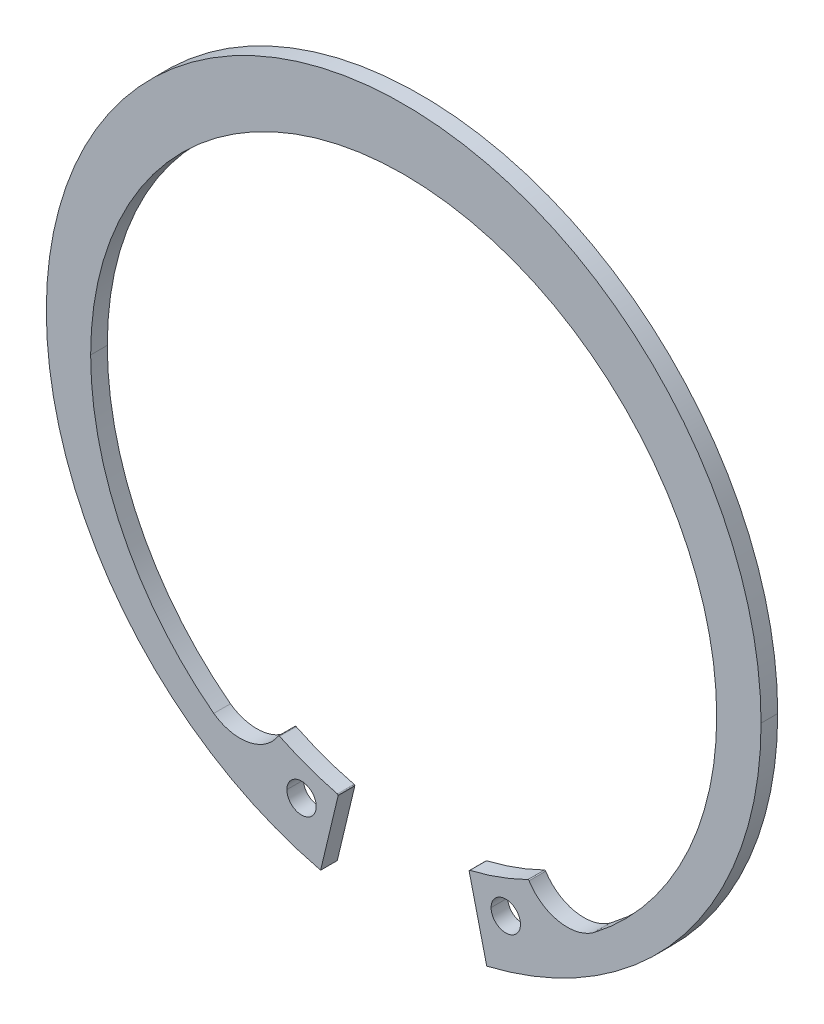
ISO-10303-21;
HEADER;
FILE_DESCRIPTION(('STEP AP214'),'2;1');
FILE_NAME('part.step','',(''),(''),'','','');
FILE_SCHEMA(('AUTOMOTIVE_DESIGN { 1 0 10303 214 1 1 1 1 }'));
ENDSEC;
DATA;
#1=APPLICATION_CONTEXT('core data for automotive mechanical design processes');
#2=APPLICATION_PROTOCOL_DEFINITION('international standard','automotive_design',2000,#1);
#3=PRODUCT_CONTEXT('',#1,'mechanical');
#4=PRODUCT('Part','Part','',(#3));
#5=PRODUCT_RELATED_PRODUCT_CATEGORY('part','',(#4));
#6=PRODUCT_DEFINITION_FORMATION('','',#4);
#7=PRODUCT_DEFINITION_CONTEXT('part definition',#1,'design');
#8=PRODUCT_DEFINITION('design','',#6,#7);
#9=PRODUCT_DEFINITION_SHAPE('','',#8);
#10=(LENGTH_UNIT() NAMED_UNIT(*) SI_UNIT(.MILLI.,.METRE.));
#11=(NAMED_UNIT(*) PLANE_ANGLE_UNIT() SI_UNIT($,.RADIAN.));
#12=(NAMED_UNIT(*) SI_UNIT($,.STERADIAN.) SOLID_ANGLE_UNIT());
#13=UNCERTAINTY_MEASURE_WITH_UNIT(LENGTH_MEASURE(1.E-05),#10,'distance_accuracy_value','');
#14=(GEOMETRIC_REPRESENTATION_CONTEXT(3) GLOBAL_UNCERTAINTY_ASSIGNED_CONTEXT((#13)) GLOBAL_UNIT_ASSIGNED_CONTEXT((#10,
#11,#12)) REPRESENTATION_CONTEXT('',''));
#15=CARTESIAN_POINT('',(0.,0.,0.));
#16=DIRECTION('',(0.,0.,1.));
#17=DIRECTION('',(1.,0.,0.));
#18=AXIS2_PLACEMENT_3D('',#15,#16,#17);
#19=CARTESIAN_POINT('',(-6.79031486078418,-27.9880621710655,-1.70000000000003));
#20=DIRECTION('',(0.,0.,1.));
#21=DIRECTION('',(1.,0.,0.));
#22=AXIS2_PLACEMENT_3D('',#19,#20,#21);
#23=CYLINDRICAL_SURFACE('',#22,0.100000000000003);
#24=DIRECTION('',(0.,0.,1.));
#25=VECTOR('',#24,1.);
#26=CARTESIAN_POINT('',(-6.69031486078418,-27.9880621710653,-1.69999999999959));
#27=LINE('',#26,#25);
#28=CARTESIAN_POINT('',(-6.69031486078418,-27.9880621710653,-1.69999999999959));
#29=VERTEX_POINT('',#28);
#30=CARTESIAN_POINT('',(-6.69031486078418,-27.9880621710662,0.));
#31=VERTEX_POINT('',#30);
#32=EDGE_CURVE('E239',#29,#31,#27,.T.);
#33=ORIENTED_EDGE('',*,*,#32,.F.);
#34=CARTESIAN_POINT('',(-6.79031486078418,-27.9880621710655,-1.70000000000003));
#35=DIRECTION('',(0.,0.,1.));
#36=DIRECTION('',(-1.,0.,0.));
#37=AXIS2_PLACEMENT_3D('',#34,#35,#36);
#38=CIRCLE('',#37,0.100000000000003);
#39=CARTESIAN_POINT('',(-6.76673737862868,-27.8908813996381,-1.70000000000003));
#40=VERTEX_POINT('',#39);
#41=EDGE_CURVE('E271',#29,#40,#38,.T.);
#42=ORIENTED_EDGE('',*,*,#41,.T.);
#43=DIRECTION('',(0.,0.,1.));
#44=VECTOR('',#43,1.);
#45=CARTESIAN_POINT('',(-6.76673737862868,-27.8908813996381,-1.70000000000003));
#46=LINE('',#45,#44);
#47=CARTESIAN_POINT('',(-6.76673737862868,-27.8908813996375,0.));
#48=VERTEX_POINT('',#47);
#49=EDGE_CURVE('E336',#40,#48,#46,.T.);
#50=ORIENTED_EDGE('',*,*,#49,.T.);
#51=CARTESIAN_POINT('',(-6.79031486078418,-27.988062171066,0.));
#52=DIRECTION('',(0.,0.,1.));
#53=DIRECTION('',(-1.,0.,0.));
#54=AXIS2_PLACEMENT_3D('',#51,#52,#53);
#55=CIRCLE('',#54,0.100000000000003);
#56=EDGE_CURVE('E189',#31,#48,#55,.T.);
#57=ORIENTED_EDGE('',*,*,#56,.F.);
#58=EDGE_LOOP('',(#33,#42,#50,#57));
#59=FACE_BOUND('',#58,.T.);
#60=ADVANCED_FACE('F16',(#59),#23,.T.);
#61=CARTESIAN_POINT('',(-12.7185706541598,-25.8394651747116,-1.70000000000003));
#62=DIRECTION('',(0.,0.,1.));
#63=DIRECTION('',(1.,0.,0.));
#64=AXIS2_PLACEMENT_3D('',#61,#62,#63);
#65=CYLINDRICAL_SURFACE('',#64,0.1);
#66=CARTESIAN_POINT('',(-12.7185706541598,-25.8394651747118,0.));
#67=DIRECTION('',(0.,0.,1.));
#68=DIRECTION('',(1.,0.,0.));
#69=AXIS2_PLACEMENT_3D('',#66,#67,#68);
#70=CIRCLE('',#69,0.1);
#71=CARTESIAN_POINT('',(-12.6744089504996,-25.7497448095225,0.));
#72=VERTEX_POINT('',#71);
#73=CARTESIAN_POINT('',(-12.8032663505432,-25.7862990293358,0.));
#74=VERTEX_POINT('',#73);
#75=EDGE_CURVE('E299',#72,#74,#70,.T.);
#76=ORIENTED_EDGE('',*,*,#75,.F.);
#77=DIRECTION('',(0.,0.,1.));
#78=VECTOR('',#77,1.);
#79=CARTESIAN_POINT('',(-12.6744089504996,-25.7497448095225,-1.70000000000048));
#80=LINE('',#79,#78);
#81=CARTESIAN_POINT('',(-12.6744089504996,-25.7497448095225,-1.70000000000048));
#82=VERTEX_POINT('',#81);
#83=EDGE_CURVE('E340',#82,#72,#80,.T.);
#84=ORIENTED_EDGE('',*,*,#83,.F.);
#85=CARTESIAN_POINT('',(-12.7185706541598,-25.8394651747116,-1.70000000000003));
#86=DIRECTION('',(0.,0.,1.));
#87=DIRECTION('',(1.,0.,0.));
#88=AXIS2_PLACEMENT_3D('',#85,#86,#87);
#89=CIRCLE('',#88,0.1);
#90=CARTESIAN_POINT('',(-12.8032663505432,-25.7862990293358,-1.69999999999959));
#91=VERTEX_POINT('',#90);
#92=EDGE_CURVE('E234',#82,#91,#89,.T.);
#93=ORIENTED_EDGE('',*,*,#92,.T.);
#94=DIRECTION('',(0.,0.,1.));
#95=VECTOR('',#94,1.);
#96=CARTESIAN_POINT('',(-12.8032663505432,-25.7862990293358,-1.69999999999959));
#97=LINE('',#96,#95);
#98=EDGE_CURVE('E11',#91,#74,#97,.T.);
#99=ORIENTED_EDGE('',*,*,#98,.T.);
#100=EDGE_LOOP('',(#76,#84,#93,#99));
#101=FACE_BOUND('',#100,.T.);
#102=ADVANCED_FACE('F529',(#101),#65,.T.);
#103=CARTESIAN_POINT('',(-16.7085661781746,-23.3348198250933,-1.70000000000003));
#104=DIRECTION('',(0.,0.,1.));
#105=DIRECTION('',(1.,0.,0.));
#106=AXIS2_PLACEMENT_3D('',#103,#104,#105);
#107=CYLINDRICAL_SURFACE('',#106,4.61097788245976);
#108=CARTESIAN_POINT('',(-16.7085661781746,-23.3348198250931,0.));
#109=DIRECTION('',(0.,0.,-1.));
#110=DIRECTION('',(1.,0.,0.));
#111=AXIS2_PLACEMENT_3D('',#108,#109,#110);
#112=CIRCLE('',#111,4.61097788245976);
#113=CARTESIAN_POINT('',(-19.3929853104109,-27.0838211527826,0.));
#114=VERTEX_POINT('',#113);
#115=EDGE_CURVE('E302',#74,#114,#112,.T.);
#116=ORIENTED_EDGE('',*,*,#115,.F.);
#117=ORIENTED_EDGE('',*,*,#98,.F.);
#118=CARTESIAN_POINT('',(-16.7085661781746,-23.3348198250933,-1.70000000000003));
#119=DIRECTION('',(0.,0.,-1.));
#120=DIRECTION('',(1.,0.,0.));
#121=AXIS2_PLACEMENT_3D('',#118,#119,#120);
#122=CIRCLE('',#121,4.61097788245976);
#123=CARTESIAN_POINT('',(-19.3929853104108,-27.0838211527826,-1.70000000000048));
#124=VERTEX_POINT('',#123);
#125=EDGE_CURVE('E228',#91,#124,#122,.T.);
#126=ORIENTED_EDGE('',*,*,#125,.T.);
#127=DIRECTION('',(0.,0.,1.));
#128=VECTOR('',#127,1.);
#129=CARTESIAN_POINT('',(-19.3929853104108,-27.0838211527826,-1.70000000000048));
#130=LINE('',#129,#128);
#131=EDGE_CURVE('E30',#124,#114,#130,.T.);
#132=ORIENTED_EDGE('',*,*,#131,.T.);
#133=EDGE_LOOP('',(#116,#117,#126,#132));
#134=FACE_BOUND('',#133,.T.);
#135=ADVANCED_FACE('F528',(#134),#107,.F.);
#136=CARTESIAN_POINT('',(-21.2495702265985,-29.6766872340033,-1.70000000000003));
#137=DIRECTION('',(-0.813059924219273,0.582180006208175,0.));
#138=DIRECTION('',(0.,0.,1.));
#139=AXIS2_PLACEMENT_3D('',#136,#137,#138);
#140=PLANE('',#139);
#141=DIRECTION('',(-0.582180006208175,-0.813059924219272,0.));
#142=VECTOR('',#141,1.);
#143=CARTESIAN_POINT('',(-21.2495702265985,-29.6766872340033,-1.70000000000003));
#144=LINE('',#143,#142);
#145=CARTESIAN_POINT('',(-19.3944374301315,-27.0858491515757,-1.70000000000003));
#146=VERTEX_POINT('',#145);
#147=EDGE_CURVE('E231',#124,#146,#144,.T.);
#148=ORIENTED_EDGE('',*,*,#147,.T.);
#149=DIRECTION('',(0.,0.,1.));
#150=VECTOR('',#149,1.);
#151=CARTESIAN_POINT('',(-19.3944374301315,-27.0858491515757,-1.70000000000003));
#152=LINE('',#151,#150);
#153=CARTESIAN_POINT('',(-19.3944374301315,-27.0858491515762,-4.44089209850063E-13));
#154=VERTEX_POINT('',#153);
#155=EDGE_CURVE('E253',#146,#154,#152,.T.);
#156=ORIENTED_EDGE('',*,*,#155,.T.);
#157=DIRECTION('',(-0.582180006208175,-0.813059924219272,0.));
#158=VECTOR('',#157,1.);
#159=CARTESIAN_POINT('',(-21.2495702265985,-29.6766872340033,0.));
#160=LINE('',#159,#158);
#161=EDGE_CURVE('E233',#114,#154,#160,.T.);
#162=ORIENTED_EDGE('',*,*,#161,.F.);
#163=ORIENTED_EDGE('',*,*,#131,.F.);
#164=EDGE_LOOP('',(#148,#156,#162,#163));
#165=FACE_BOUND('',#164,.T.);
#166=ADVANCED_FACE('F534',(#165),#140,.T.);
#167=CARTESIAN_POINT('',(0.,0.,-1.70000000000003));
#168=DIRECTION('',(0.,0.,1.));
#169=DIRECTION('',(1.,0.,0.));
#170=AXIS2_PLACEMENT_3D('',#167,#168,#169);
#171=CYLINDRICAL_SURFACE('',#170,28.7);
#172=CARTESIAN_POINT('',(0.,0.,0.));
#173=DIRECTION('',(0.,0.,-1.));
#174=DIRECTION('',(1.,0.,0.));
#175=AXIS2_PLACEMENT_3D('',#172,#173,#174);
#176=CIRCLE('',#175,28.7);
#177=EDGE_CURVE('E304',#48,#72,#176,.T.);
#178=ORIENTED_EDGE('',*,*,#177,.F.);
#179=ORIENTED_EDGE('',*,*,#49,.F.);
#180=CARTESIAN_POINT('',(0.,0.,-1.70000000000003));
#181=DIRECTION('',(0.,0.,-1.));
#182=DIRECTION('',(1.,0.,0.));
#183=AXIS2_PLACEMENT_3D('',#180,#181,#182);
#184=CIRCLE('',#183,28.7);
#185=EDGE_CURVE('E274',#40,#82,#184,.T.);
#186=ORIENTED_EDGE('',*,*,#185,.T.);
#187=ORIENTED_EDGE('',*,*,#83,.T.);
#188=EDGE_LOOP('',(#178,#179,#186,#187));
#189=FACE_BOUND('',#188,.T.);
#190=ADVANCED_FACE('F541',(#189),#171,.F.);
#191=CARTESIAN_POINT('',(19.3929853104109,-27.0838211527822,-1.70000000000003));
#192=DIRECTION('',(0.813059924219273,0.582180006208175,0.));
#193=DIRECTION('',(0.,0.,-1.));
#194=AXIS2_PLACEMENT_3D('',#191,#192,#193);
#195=PLANE('',#194);
#196=DIRECTION('',(-0.582180006208175,0.813059924219272,0.));
#197=VECTOR('',#196,1.);
#198=CARTESIAN_POINT('',(19.3929853104109,-27.0838211527826,0.));
#199=LINE('',#198,#197);
#200=CARTESIAN_POINT('',(19.3944374301315,-27.0858491515751,0.));
#201=VERTEX_POINT('',#200);
#202=CARTESIAN_POINT('',(19.3929853104109,-27.0838211527826,0.));
#203=VERTEX_POINT('',#202);
#204=EDGE_CURVE('E238',#201,#203,#199,.T.);
#205=ORIENTED_EDGE('',*,*,#204,.F.);
#206=DIRECTION('',(0.,0.,-1.));
#207=VECTOR('',#206,1.);
#208=CARTESIAN_POINT('',(19.3944374301315,-27.085849151576,-1.69999999999959));
#209=LINE('',#208,#207);
#210=CARTESIAN_POINT('',(19.3944374301315,-27.085849151576,-1.69999999999959));
#211=VERTEX_POINT('',#210);
#212=EDGE_CURVE('E259',#201,#211,#209,.T.);
#213=ORIENTED_EDGE('',*,*,#212,.T.);
#214=DIRECTION('',(-0.582180006208175,0.813059924219272,0.));
#215=VECTOR('',#214,1.);
#216=CARTESIAN_POINT('',(19.3929853104109,-27.0838211527822,-1.70000000000003));
#217=LINE('',#216,#215);
#218=CARTESIAN_POINT('',(19.3929853104109,-27.0838211527822,-1.70000000000003));
#219=VERTEX_POINT('',#218);
#220=EDGE_CURVE('E20',#211,#219,#217,.T.);
#221=ORIENTED_EDGE('',*,*,#220,.T.);
#222=DIRECTION('',(0.,0.,1.));
#223=VECTOR('',#222,1.);
#224=CARTESIAN_POINT('',(19.3929853104109,-27.0838211527822,-1.70000000000003));
#225=LINE('',#224,#223);
#226=EDGE_CURVE('E285',#219,#203,#225,.T.);
#227=ORIENTED_EDGE('',*,*,#226,.T.);
#228=EDGE_LOOP('',(#205,#213,#221,#227));
#229=FACE_BOUND('',#228,.T.);
#230=ADVANCED_FACE('F588',(#229),#195,.T.);
#231=CARTESIAN_POINT('',(16.7085661781746,-23.3348198250938,-1.69999999999959));
#232=DIRECTION('',(0.,0.,1.));
#233=DIRECTION('',(1.,0.,0.));
#234=AXIS2_PLACEMENT_3D('',#231,#232,#233);
#235=CYLINDRICAL_SURFACE('',#234,4.61097788245976);
#236=CARTESIAN_POINT('',(16.7085661781746,-23.3348198250931,0.));
#237=DIRECTION('',(0.,0.,-1.));
#238=DIRECTION('',(1.,0.,0.));
#239=AXIS2_PLACEMENT_3D('',#236,#237,#238);
#240=CIRCLE('',#239,4.61097788245976);
#241=CARTESIAN_POINT('',(12.8032663505432,-25.7862990293358,0.));
#242=VERTEX_POINT('',#241);
#243=EDGE_CURVE('E254',#203,#242,#240,.T.);
#244=ORIENTED_EDGE('',*,*,#243,.F.);
#245=ORIENTED_EDGE('',*,*,#226,.F.);
#246=CARTESIAN_POINT('',(16.7085661781746,-23.3348198250938,-1.69999999999959));
#247=DIRECTION('',(0.,0.,-1.));
#248=DIRECTION('',(1.,0.,0.));
#249=AXIS2_PLACEMENT_3D('',#246,#247,#248);
#250=CIRCLE('',#249,4.61097788245976);
#251=CARTESIAN_POINT('',(12.8032663505432,-25.7862990293358,-1.69999999999959));
#252=VERTEX_POINT('',#251);
#253=EDGE_CURVE('E316',#219,#252,#250,.T.);
#254=ORIENTED_EDGE('',*,*,#253,.T.);
#255=DIRECTION('',(0.,0.,1.));
#256=VECTOR('',#255,1.);
#257=CARTESIAN_POINT('',(12.8032663505432,-25.7862990293358,-1.69999999999959));
#258=LINE('',#257,#256);
#259=EDGE_CURVE('E282',#252,#242,#258,.T.);
#260=ORIENTED_EDGE('',*,*,#259,.T.);
#261=EDGE_LOOP('',(#244,#245,#254,#260));
#262=FACE_BOUND('',#261,.T.);
#263=ADVANCED_FACE('F581',(#262),#235,.F.);
#264=CARTESIAN_POINT('',(12.7185706541598,-25.8394651747118,-1.70000000000003));
#265=DIRECTION('',(0.,0.,1.));
#266=DIRECTION('',(1.,0.,0.));
#267=AXIS2_PLACEMENT_3D('',#264,#265,#266);
#268=CYLINDRICAL_SURFACE('',#267,0.1);
#269=CARTESIAN_POINT('',(12.7185706541598,-25.8394651747118,0.));
#270=DIRECTION('',(0.,0.,1.));
#271=DIRECTION('',(-1.,0.,0.));
#272=AXIS2_PLACEMENT_3D('',#269,#270,#271);
#273=CIRCLE('',#272,0.1);
#274=CARTESIAN_POINT('',(12.6744089504995,-25.7497448095219,0.));
#275=VERTEX_POINT('',#274);
#276=EDGE_CURVE('E300',#242,#275,#273,.T.);
#277=ORIENTED_EDGE('',*,*,#276,.F.);
#278=ORIENTED_EDGE('',*,*,#259,.F.);
#279=CARTESIAN_POINT('',(12.7185706541598,-25.8394651747118,-1.70000000000003));
#280=DIRECTION('',(0.,0.,1.));
#281=DIRECTION('',(-1.,0.,0.));
#282=AXIS2_PLACEMENT_3D('',#279,#280,#281);
#283=CIRCLE('',#282,0.1);
#284=CARTESIAN_POINT('',(12.6744089504995,-25.7497448095219,-1.70000000000003));
#285=VERTEX_POINT('',#284);
#286=EDGE_CURVE('E315',#252,#285,#283,.T.);
#287=ORIENTED_EDGE('',*,*,#286,.T.);
#288=DIRECTION('',(0.,0.,1.));
#289=VECTOR('',#288,1.);
#290=CARTESIAN_POINT('',(12.6744089504995,-25.7497448095219,-1.70000000000003));
#291=LINE('',#290,#289);
#292=EDGE_CURVE('E331',#285,#275,#291,.T.);
#293=ORIENTED_EDGE('',*,*,#292,.T.);
#294=EDGE_LOOP('',(#277,#278,#287,#293));
#295=FACE_BOUND('',#294,.T.);
#296=ADVANCED_FACE('F579',(#295),#268,.T.);
#297=CARTESIAN_POINT('',(6.79031486078418,-27.9880621710646,-1.70000000000048));
#298=DIRECTION('',(0.,0.,1.));
#299=DIRECTION('',(1.,0.,0.));
#300=AXIS2_PLACEMENT_3D('',#297,#298,#299);
#301=CYLINDRICAL_SURFACE('',#300,0.100000000000002);
#302=CARTESIAN_POINT('',(6.79031486078418,-27.9880621710653,0.));
#303=DIRECTION('',(0.,0.,1.));
#304=DIRECTION('',(1.,0.,0.));
#305=AXIS2_PLACEMENT_3D('',#302,#303,#304);
#306=CIRCLE('',#305,0.100000000000002);
#307=CARTESIAN_POINT('',(6.76673737862868,-27.8908813996377,0.));
#308=VERTEX_POINT('',#307);
#309=CARTESIAN_POINT('',(6.69305280892274,-28.0113020778572,0.));
#310=VERTEX_POINT('',#309);
#311=EDGE_CURVE('E179',#308,#310,#306,.T.);
#312=ORIENTED_EDGE('',*,*,#311,.F.);
#313=DIRECTION('',(0.,0.,1.));
#314=VECTOR('',#313,1.);
#315=CARTESIAN_POINT('',(6.76673737862868,-27.8908813996377,-1.70000000000003));
#316=LINE('',#315,#314);
#317=CARTESIAN_POINT('',(6.76673737862868,-27.8908813996377,-1.70000000000003));
#318=VERTEX_POINT('',#317);
#319=EDGE_CURVE('E287',#318,#308,#316,.T.);
#320=ORIENTED_EDGE('',*,*,#319,.F.);
#321=CARTESIAN_POINT('',(6.79031486078418,-27.9880621710646,-1.70000000000048));
#322=DIRECTION('',(0.,0.,1.));
#323=DIRECTION('',(1.,0.,0.));
#324=AXIS2_PLACEMENT_3D('',#321,#322,#323);
#325=CIRCLE('',#324,0.100000000000002);
#326=CARTESIAN_POINT('',(6.69305280892274,-28.0113020778567,-1.70000000000003));
#327=VERTEX_POINT('',#326);
#328=EDGE_CURVE('E198',#318,#327,#325,.T.);
#329=ORIENTED_EDGE('',*,*,#328,.T.);
#330=DIRECTION('',(0.,0.,1.));
#331=VECTOR('',#330,1.);
#332=CARTESIAN_POINT('',(6.69305280892274,-28.0113020778567,-1.70000000000003));
#333=LINE('',#332,#331);
#334=EDGE_CURVE('E193',#327,#310,#333,.T.);
#335=ORIENTED_EDGE('',*,*,#334,.T.);
#336=EDGE_LOOP('',(#312,#320,#329,#335));
#337=FACE_BOUND('',#336,.T.);
#338=ADVANCED_FACE('F192',(#337),#301,.T.);
#339=CARTESIAN_POINT('',(0.,0.,-1.70000000000003));
#340=DIRECTION('',(0.,0.,1.));
#341=DIRECTION('',(1.,0.,0.));
#342=AXIS2_PLACEMENT_3D('',#339,#340,#341);
#343=CYLINDRICAL_SURFACE('',#342,28.7);
#344=CARTESIAN_POINT('',(0.,0.,0.));
#345=DIRECTION('',(0.,0.,-1.));
#346=DIRECTION('',(1.,0.,0.));
#347=AXIS2_PLACEMENT_3D('',#344,#345,#346);
#348=CIRCLE('',#347,28.7);
#349=EDGE_CURVE('E186',#275,#308,#348,.T.);
#350=ORIENTED_EDGE('',*,*,#349,.F.);
#351=ORIENTED_EDGE('',*,*,#292,.F.);
#352=CARTESIAN_POINT('',(0.,0.,-1.70000000000003));
#353=DIRECTION('',(0.,0.,-1.));
#354=DIRECTION('',(1.,0.,0.));
#355=AXIS2_PLACEMENT_3D('',#352,#353,#354);
#356=CIRCLE('',#355,28.7);
#357=EDGE_CURVE('E320',#285,#318,#356,.T.);
#358=ORIENTED_EDGE('',*,*,#357,.T.);
#359=ORIENTED_EDGE('',*,*,#319,.T.);
#360=EDGE_LOOP('',(#350,#351,#358,#359));
#361=FACE_BOUND('',#360,.T.);
#362=ADVANCED_FACE('F443',(#361),#343,.F.);
#363=CARTESIAN_POINT('',(-10.4293753638042,-30.094029798631,-1.70000000000048));
#364=DIRECTION('',(0.,0.,1.));
#365=DIRECTION('',(1.,0.,0.));
#366=AXIS2_PLACEMENT_3D('',#363,#364,#365);
#367=CYLINDRICAL_SURFACE('',#366,1.5);
#368=DIRECTION('',(0.,0.,1.));
#369=VECTOR('',#368,1.);
#370=CARTESIAN_POINT('',(-11.9293753638042,-30.094029798631,-1.69999999999959));
#371=LINE('',#370,#369);
#372=CARTESIAN_POINT('',(-11.9293753638042,-30.094029798631,-1.69999999999959));
#373=VERTEX_POINT('',#372);
#374=CARTESIAN_POINT('',(-11.9293753638042,-30.0940297986312,0.));
#375=VERTEX_POINT('',#374);
#376=EDGE_CURVE('E229',#373,#375,#371,.T.);
#377=ORIENTED_EDGE('',*,*,#376,.F.);
#378=CARTESIAN_POINT('',(-10.4293753638042,-30.094029798631,-1.70000000000048));
#379=DIRECTION('',(0.,0.,1.));
#380=DIRECTION('',(1.,0.,0.));
#381=AXIS2_PLACEMENT_3D('',#378,#379,#380);
#382=CIRCLE('',#381,1.5);
#383=CARTESIAN_POINT('',(-8.92937536380419,-30.0940297986307,-1.70000000000003));
#384=VERTEX_POINT('',#383);
#385=EDGE_CURVE('E237',#384,#373,#382,.T.);
#386=ORIENTED_EDGE('',*,*,#385,.F.);
#387=DIRECTION('',(0.,0.,1.));
#388=VECTOR('',#387,1.);
#389=CARTESIAN_POINT('',(-8.92937536380419,-30.0940297986307,-1.70000000000003));
#390=LINE('',#389,#388);
#391=CARTESIAN_POINT('',(-8.92937536380419,-30.0940297986312,0.));
#392=VERTEX_POINT('',#391);
#393=EDGE_CURVE('E227',#384,#392,#390,.T.);
#394=ORIENTED_EDGE('',*,*,#393,.T.);
#395=CARTESIAN_POINT('',(-10.4293753638042,-30.094029798631,4.44089209850063E-13));
#396=DIRECTION('',(0.,0.,1.));
#397=DIRECTION('',(1.,0.,0.));
#398=AXIS2_PLACEMENT_3D('',#395,#396,#397);
#399=CIRCLE('',#398,1.5);
#400=EDGE_CURVE('E332',#392,#375,#399,.T.);
#401=ORIENTED_EDGE('',*,*,#400,.T.);
#402=EDGE_LOOP('',(#377,#386,#394,#401));
#403=FACE_BOUND('',#402,.T.);
#404=ADVANCED_FACE('F569',(#403),#367,.F.);
#405=CARTESIAN_POINT('',(10.4293753638042,-30.0940297986307,-1.70000000000003));
#406=DIRECTION('',(0.,0.,1.));
#407=DIRECTION('',(1.,0.,0.));
#408=AXIS2_PLACEMENT_3D('',#405,#406,#407);
#409=CYLINDRICAL_SURFACE('',#408,1.5);
#410=DIRECTION('',(0.,0.,1.));
#411=VECTOR('',#410,1.);
#412=CARTESIAN_POINT('',(8.92937536380419,-30.0940297986307,-1.70000000000003));
#413=LINE('',#412,#411);
#414=CARTESIAN_POINT('',(8.92937536380419,-30.0940297986307,-1.70000000000003));
#415=VERTEX_POINT('',#414);
#416=CARTESIAN_POINT('',(8.92937536380419,-30.0940297986307,4.44089209850063E-13));
#417=VERTEX_POINT('',#416);
#418=EDGE_CURVE('E261',#415,#417,#413,.T.);
#419=ORIENTED_EDGE('',*,*,#418,.F.);
#420=CARTESIAN_POINT('',(10.4293753638042,-30.0940297986307,-1.70000000000003));
#421=DIRECTION('',(0.,0.,1.));
#422=DIRECTION('',(1.,0.,0.));
#423=AXIS2_PLACEMENT_3D('',#420,#421,#422);
#424=CIRCLE('',#423,1.5);
#425=CARTESIAN_POINT('',(11.9293753638042,-30.0940297986305,-1.70000000000003));
#426=VERTEX_POINT('',#425);
#427=EDGE_CURVE('E277',#426,#415,#424,.T.);
#428=ORIENTED_EDGE('',*,*,#427,.F.);
#429=DIRECTION('',(0.,0.,1.));
#430=VECTOR('',#429,1.);
#431=CARTESIAN_POINT('',(11.9293753638042,-30.0940297986305,-1.70000000000003));
#432=LINE('',#431,#430);
#433=CARTESIAN_POINT('',(11.9293753638042,-30.094029798631,4.44089209850063E-13));
#434=VERTEX_POINT('',#433);
#435=EDGE_CURVE('E368',#426,#434,#432,.T.);
#436=ORIENTED_EDGE('',*,*,#435,.T.);
#437=CARTESIAN_POINT('',(10.4293753638042,-30.0940297986312,8.88178419700125E-13));
#438=DIRECTION('',(0.,0.,1.));
#439=DIRECTION('',(1.,0.,0.));
#440=AXIS2_PLACEMENT_3D('',#437,#438,#439);
#441=CIRCLE('',#440,1.5);
#442=EDGE_CURVE('E333',#434,#417,#441,.T.);
#443=ORIENTED_EDGE('',*,*,#442,.T.);
#444=EDGE_LOOP('',(#419,#428,#436,#443));
#445=FACE_BOUND('',#444,.T.);
#446=ADVANCED_FACE('F566',(#445),#409,.F.);
#447=CARTESIAN_POINT('',(0.,0.,0.));
#448=DIRECTION('',(0.,0.,1.));
#449=DIRECTION('',(1.,0.,0.));
#450=AXIS2_PLACEMENT_3D('',#447,#448,#449);
#451=PLANE('',#450);
#452=ORIENTED_EDGE('',*,*,#400,.F.);
#453=CARTESIAN_POINT('',(-10.4293753638042,-30.094029798631,4.44089209850063E-13));
#454=DIRECTION('',(0.,0.,1.));
#455=DIRECTION('',(1.,0.,0.));
#456=AXIS2_PLACEMENT_3D('',#453,#454,#455);
#457=CIRCLE('',#456,1.5);
#458=EDGE_CURVE('E224',#375,#392,#457,.T.);
#459=ORIENTED_EDGE('',*,*,#458,.F.);
#460=EDGE_LOOP('',(#452,#459));
#461=FACE_BOUND('',#460,.T.);
#462=ORIENTED_EDGE('',*,*,#442,.F.);
#463=CARTESIAN_POINT('',(10.4293753638042,-30.0940297986312,8.88178419700125E-13));
#464=DIRECTION('',(0.,0.,1.));
#465=DIRECTION('',(1.,0.,0.));
#466=AXIS2_PLACEMENT_3D('',#463,#464,#465);
#467=CIRCLE('',#466,1.5);
#468=EDGE_CURVE('E264',#417,#434,#467,.T.);
#469=ORIENTED_EDGE('',*,*,#468,.F.);
#470=EDGE_LOOP('',(#462,#469));
#471=FACE_BOUND('',#470,.T.);
#472=ORIENTED_EDGE('',*,*,#161,.T.);
#473=CARTESIAN_POINT('',(0.,-1.6702499860799,0.));
#474=DIRECTION('',(0.,0.,-1.));
#475=DIRECTION('',(1.,0.,0.));
#476=AXIS2_PLACEMENT_3D('',#473,#474,#475);
#477=CIRCLE('',#476,31.9702499860798);
#478=CARTESIAN_POINT('',(-31.9702499860798,-1.67024998607967,0.));
#479=VERTEX_POINT('',#478);
#480=EDGE_CURVE('E391',#154,#479,#477,.T.);
#481=ORIENTED_EDGE('',*,*,#480,.T.);
#482=CARTESIAN_POINT('',(0.,-1.6702499860799,0.));
#483=DIRECTION('',(0.,0.,-1.));
#484=DIRECTION('',(1.,0.,0.));
#485=AXIS2_PLACEMENT_3D('',#482,#483,#484);
#486=CIRCLE('',#485,31.9702499860798);
#487=CARTESIAN_POINT('',(31.9702499860798,-1.6702499860799,4.44089209850063E-13));
#488=VERTEX_POINT('',#487);
#489=EDGE_CURVE('E341',#479,#488,#486,.T.);
#490=ORIENTED_EDGE('',*,*,#489,.T.);
#491=CARTESIAN_POINT('',(0.,-1.6702499860799,0.));
#492=DIRECTION('',(0.,0.,-1.));
#493=DIRECTION('',(1.,0.,0.));
#494=AXIS2_PLACEMENT_3D('',#491,#492,#493);
#495=CIRCLE('',#494,31.9702499860798);
#496=EDGE_CURVE('E323',#488,#201,#495,.T.);
#497=ORIENTED_EDGE('',*,*,#496,.T.);
#498=ORIENTED_EDGE('',*,*,#204,.T.);
#499=ORIENTED_EDGE('',*,*,#243,.T.);
#500=ORIENTED_EDGE('',*,*,#276,.T.);
#501=ORIENTED_EDGE('',*,*,#349,.T.);
#502=ORIENTED_EDGE('',*,*,#311,.T.);
#503=DIRECTION('',(0.232399067920304,-0.972620518614415,0.));
#504=VECTOR('',#503,1.);
#505=CARTESIAN_POINT('',(8.48256597909108,-35.5006489294261,0.));
#506=LINE('',#505,#504);
#507=CARTESIAN_POINT('',(8.48256597909108,-35.5006489294261,0.));
#508=VERTEX_POINT('',#507);
#509=EDGE_CURVE('E181',#310,#508,#506,.T.);
#510=ORIENTED_EDGE('',*,*,#509,.T.);
#511=CARTESIAN_POINT('',(0.,0.,0.));
#512=DIRECTION('',(0.,0.,1.));
#513=DIRECTION('',(1.,0.,0.));
#514=AXIS2_PLACEMENT_3D('',#511,#512,#513);
#515=CIRCLE('',#514,36.5);
#516=CARTESIAN_POINT('',(36.5,0.,0.));
#517=VERTEX_POINT('',#516);
#518=EDGE_CURVE('E222',#508,#517,#515,.T.);
#519=ORIENTED_EDGE('',*,*,#518,.T.);
#520=CARTESIAN_POINT('',(0.,0.,0.));
#521=DIRECTION('',(0.,0.,1.));
#522=DIRECTION('',(1.,0.,0.));
#523=AXIS2_PLACEMENT_3D('',#520,#521,#522);
#524=CIRCLE('',#523,36.5);
#525=CARTESIAN_POINT('',(-36.5,-2.22044604925031E-13,0.));
#526=VERTEX_POINT('',#525);
#527=EDGE_CURVE('E389',#517,#526,#524,.T.);
#528=ORIENTED_EDGE('',*,*,#527,.T.);
#529=CARTESIAN_POINT('',(0.,0.,0.));
#530=DIRECTION('',(0.,0.,1.));
#531=DIRECTION('',(1.,0.,0.));
#532=AXIS2_PLACEMENT_3D('',#529,#530,#531);
#533=CIRCLE('',#532,36.5);
#534=CARTESIAN_POINT('',(-8.48256597909109,-35.5006489294263,0.));
#535=VERTEX_POINT('',#534);
#536=EDGE_CURVE('E210',#526,#535,#533,.T.);
#537=ORIENTED_EDGE('',*,*,#536,.T.);
#538=DIRECTION('',(0.232399067920304,0.972620518614414,0.));
#539=VECTOR('',#538,1.);
#540=CARTESIAN_POINT('',(-8.48256597909109,-35.5006489294263,0.));
#541=LINE('',#540,#539);
#542=CARTESIAN_POINT('',(-6.69305280892274,-28.0113020778572,0.));
#543=VERTEX_POINT('',#542);
#544=EDGE_CURVE('E330',#535,#543,#541,.T.);
#545=ORIENTED_EDGE('',*,*,#544,.T.);
#546=CARTESIAN_POINT('',(-6.79031486078418,-27.988062171066,0.));
#547=DIRECTION('',(0.,0.,1.));
#548=DIRECTION('',(-1.,0.,0.));
#549=AXIS2_PLACEMENT_3D('',#546,#547,#548);
#550=CIRCLE('',#549,0.100000000000003);
#551=EDGE_CURVE('E243',#543,#31,#550,.T.);
#552=ORIENTED_EDGE('',*,*,#551,.T.);
#553=ORIENTED_EDGE('',*,*,#56,.T.);
#554=ORIENTED_EDGE('',*,*,#177,.T.);
#555=ORIENTED_EDGE('',*,*,#75,.T.);
#556=ORIENTED_EDGE('',*,*,#115,.T.);
#557=EDGE_LOOP('',(#472,#481,#490,#497,#498,#499,#500,#501,#502,#510,#519,#528,#537,#545,#552,
#553,#554,#555,#556));
#558=FACE_BOUND('',#557,.T.);
#559=ADVANCED_FACE('F178',(#461,#471,#558),#451,.T.);
#560=CARTESIAN_POINT('',(0.,0.,-1.70000000000003));
#561=DIRECTION('',(0.,0.,1.));
#562=DIRECTION('',(1.,0.,0.));
#563=AXIS2_PLACEMENT_3D('',#560,#561,#562);
#564=PLANE('',#563);
#565=ORIENTED_EDGE('',*,*,#385,.T.);
#566=CARTESIAN_POINT('',(-10.4293753638042,-30.094029798631,-1.70000000000048));
#567=DIRECTION('',(0.,0.,1.));
#568=DIRECTION('',(1.,0.,0.));
#569=AXIS2_PLACEMENT_3D('',#566,#567,#568);
#570=CIRCLE('',#569,1.5);
#571=EDGE_CURVE('E291',#373,#384,#570,.T.);
#572=ORIENTED_EDGE('',*,*,#571,.T.);
#573=EDGE_LOOP('',(#565,#572));
#574=FACE_BOUND('',#573,.T.);
#575=ORIENTED_EDGE('',*,*,#427,.T.);
#576=CARTESIAN_POINT('',(10.4293753638042,-30.0940297986307,-1.70000000000003));
#577=DIRECTION('',(0.,0.,1.));
#578=DIRECTION('',(1.,0.,0.));
#579=AXIS2_PLACEMENT_3D('',#576,#577,#578);
#580=CIRCLE('',#579,1.5);
#581=EDGE_CURVE('E266',#415,#426,#580,.T.);
#582=ORIENTED_EDGE('',*,*,#581,.T.);
#583=EDGE_LOOP('',(#575,#582));
#584=FACE_BOUND('',#583,.T.);
#585=CARTESIAN_POINT('',(0.,-1.6702499860799,-1.69999999999959));
#586=DIRECTION('',(0.,0.,-1.));
#587=DIRECTION('',(1.,0.,0.));
#588=AXIS2_PLACEMENT_3D('',#585,#586,#587);
#589=CIRCLE('',#588,31.9702499860798);
#590=CARTESIAN_POINT('',(-31.9702499860799,-1.6702499860799,-1.69999999999959));
#591=VERTEX_POINT('',#590);
#592=EDGE_CURVE('E379',#146,#591,#589,.T.);
#593=ORIENTED_EDGE('',*,*,#592,.F.);
#594=ORIENTED_EDGE('',*,*,#147,.F.);
#595=ORIENTED_EDGE('',*,*,#125,.F.);
#596=ORIENTED_EDGE('',*,*,#92,.F.);
#597=ORIENTED_EDGE('',*,*,#185,.F.);
#598=ORIENTED_EDGE('',*,*,#41,.F.);
#599=CARTESIAN_POINT('',(-6.79031486078418,-27.9880621710655,-1.70000000000003));
#600=DIRECTION('',(0.,0.,1.));
#601=DIRECTION('',(-1.,0.,0.));
#602=AXIS2_PLACEMENT_3D('',#599,#600,#601);
#603=CIRCLE('',#602,0.100000000000003);
#604=CARTESIAN_POINT('',(-6.69305280892274,-28.0113020778565,-1.70000000000003));
#605=VERTEX_POINT('',#604);
#606=EDGE_CURVE('E244',#605,#29,#603,.T.);
#607=ORIENTED_EDGE('',*,*,#606,.F.);
#608=DIRECTION('',(0.232399067920304,0.972620518614414,0.));
#609=VECTOR('',#608,1.);
#610=CARTESIAN_POINT('',(-8.48256597909109,-35.5006489294263,-1.70000000000003));
#611=LINE('',#610,#609);
#612=CARTESIAN_POINT('',(-8.48256597909109,-35.5006489294263,-1.70000000000003));
#613=VERTEX_POINT('',#612);
#614=EDGE_CURVE('E281',#613,#605,#611,.T.);
#615=ORIENTED_EDGE('',*,*,#614,.F.);
#616=CARTESIAN_POINT('',(0.,0.,-1.70000000000003));
#617=DIRECTION('',(0.,0.,1.));
#618=DIRECTION('',(1.,0.,0.));
#619=AXIS2_PLACEMENT_3D('',#616,#617,#618);
#620=CIRCLE('',#619,36.5);
#621=CARTESIAN_POINT('',(-36.5,0.,-1.70000000000048));
#622=VERTEX_POINT('',#621);
#623=EDGE_CURVE('E270',#622,#613,#620,.T.);
#624=ORIENTED_EDGE('',*,*,#623,.F.);
#625=CARTESIAN_POINT('',(0.,0.,-1.70000000000003));
#626=DIRECTION('',(0.,0.,1.));
#627=DIRECTION('',(1.,0.,0.));
#628=AXIS2_PLACEMENT_3D('',#625,#626,#627);
#629=CIRCLE('',#628,36.5);
#630=CARTESIAN_POINT('',(36.5,-4.44089209850063E-13,-1.69999999999959));
#631=VERTEX_POINT('',#630);
#632=EDGE_CURVE('E343',#631,#622,#629,.T.);
#633=ORIENTED_EDGE('',*,*,#632,.F.);
#634=CARTESIAN_POINT('',(0.,0.,-1.70000000000003));
#635=DIRECTION('',(0.,0.,1.));
#636=DIRECTION('',(1.,0.,0.));
#637=AXIS2_PLACEMENT_3D('',#634,#635,#636);
#638=CIRCLE('',#637,36.5);
#639=CARTESIAN_POINT('',(8.48256597909108,-35.5006489294263,-1.70000000000003));
#640=VERTEX_POINT('',#639);
#641=EDGE_CURVE('E217',#640,#631,#638,.T.);
#642=ORIENTED_EDGE('',*,*,#641,.F.);
#643=DIRECTION('',(0.232399067920304,-0.972620518614415,0.));
#644=VECTOR('',#643,1.);
#645=CARTESIAN_POINT('',(8.48256597909108,-35.5006489294263,-1.70000000000003));
#646=LINE('',#645,#644);
#647=EDGE_CURVE('E199',#327,#640,#646,.T.);
#648=ORIENTED_EDGE('',*,*,#647,.F.);
#649=ORIENTED_EDGE('',*,*,#328,.F.);
#650=ORIENTED_EDGE('',*,*,#357,.F.);
#651=ORIENTED_EDGE('',*,*,#286,.F.);
#652=ORIENTED_EDGE('',*,*,#253,.F.);
#653=ORIENTED_EDGE('',*,*,#220,.F.);
#654=CARTESIAN_POINT('',(0.,-1.6702499860799,-1.69999999999959));
#655=DIRECTION('',(0.,0.,-1.));
#656=DIRECTION('',(1.,0.,0.));
#657=AXIS2_PLACEMENT_3D('',#654,#655,#656);
#658=CIRCLE('',#657,31.9702499860798);
#659=CARTESIAN_POINT('',(31.9702499860798,-1.67024998607945,-1.69999999999959));
#660=VERTEX_POINT('',#659);
#661=EDGE_CURVE('E258',#660,#211,#658,.T.);
#662=ORIENTED_EDGE('',*,*,#661,.F.);
#663=CARTESIAN_POINT('',(0.,-1.6702499860799,-1.69999999999959));
#664=DIRECTION('',(0.,0.,-1.));
#665=DIRECTION('',(1.,0.,0.));
#666=AXIS2_PLACEMENT_3D('',#663,#664,#665);
#667=CIRCLE('',#666,31.9702499860798);
#668=EDGE_CURVE('E246',#591,#660,#667,.T.);
#669=ORIENTED_EDGE('',*,*,#668,.F.);
#670=EDGE_LOOP('',(#593,#594,#595,#596,#597,#598,#607,#615,#624,#633,#642,#648,#649,#650,#651,
#652,#653,#662,#669));
#671=FACE_BOUND('',#670,.T.);
#672=ADVANCED_FACE('F455',(#574,#584,#671),#564,.F.);
#673=CARTESIAN_POINT('',(-8.48256597909109,-35.5006489294263,-1.70000000000003));
#674=DIRECTION('',(0.972620518614415,-0.232399067920303,0.));
#675=DIRECTION('',(0.,0.,-1.));
#676=AXIS2_PLACEMENT_3D('',#673,#674,#675);
#677=PLANE('',#676);
#678=ORIENTED_EDGE('',*,*,#544,.F.);
#679=DIRECTION('',(0.,0.,1.));
#680=VECTOR('',#679,1.);
#681=CARTESIAN_POINT('',(-8.48256597909109,-35.5006489294263,-1.70000000000003));
#682=LINE('',#681,#680);
#683=EDGE_CURVE('E212',#613,#535,#682,.T.);
#684=ORIENTED_EDGE('',*,*,#683,.F.);
#685=ORIENTED_EDGE('',*,*,#614,.T.);
#686=DIRECTION('',(0.,0.,1.));
#687=VECTOR('',#686,1.);
#688=CARTESIAN_POINT('',(-6.69305280892274,-28.0113020778565,-1.70000000000003));
#689=LINE('',#688,#687);
#690=EDGE_CURVE('E289',#605,#543,#689,.T.);
#691=ORIENTED_EDGE('',*,*,#690,.T.);
#692=EDGE_LOOP('',(#678,#684,#685,#691));
#693=FACE_BOUND('',#692,.T.);
#694=ADVANCED_FACE('F468',(#693),#677,.T.);
#695=CARTESIAN_POINT('',(0.,-1.6702499860799,-1.69999999999959));
#696=DIRECTION('',(0.,0.,1.));
#697=DIRECTION('',(1.,0.,0.));
#698=AXIS2_PLACEMENT_3D('',#695,#696,#697);
#699=CYLINDRICAL_SURFACE('',#698,31.9702499860798);
#700=DIRECTION('',(0.,0.,1.));
#701=VECTOR('',#700,1.);
#702=CARTESIAN_POINT('',(31.9702499860798,-1.67024998607945,-1.69999999999959));
#703=LINE('',#702,#701);
#704=EDGE_CURVE('E249',#660,#488,#703,.T.);
#705=ORIENTED_EDGE('',*,*,#704,.F.);
#706=ORIENTED_EDGE('',*,*,#661,.T.);
#707=ORIENTED_EDGE('',*,*,#212,.F.);
#708=ORIENTED_EDGE('',*,*,#496,.F.);
#709=EDGE_LOOP('',(#705,#706,#707,#708));
#710=FACE_BOUND('',#709,.T.);
#711=ADVANCED_FACE('F573',(#710),#699,.F.);
#712=CARTESIAN_POINT('',(8.48256597909108,-35.5006489294263,-1.70000000000003));
#713=DIRECTION('',(-0.972620518614415,-0.232399067920304,0.));
#714=DIRECTION('',(-0.232399067920304,0.972620518614415,0.));
#715=AXIS2_PLACEMENT_3D('',#712,#713,#714);
#716=PLANE('',#715);
#717=ORIENTED_EDGE('',*,*,#509,.F.);
#718=ORIENTED_EDGE('',*,*,#334,.F.);
#719=ORIENTED_EDGE('',*,*,#647,.T.);
#720=DIRECTION('',(0.,0.,1.));
#721=VECTOR('',#720,1.);
#722=CARTESIAN_POINT('',(8.48256597909108,-35.5006489294263,-1.70000000000003));
#723=LINE('',#722,#721);
#724=EDGE_CURVE('E204',#640,#508,#723,.T.);
#725=ORIENTED_EDGE('',*,*,#724,.T.);
#726=EDGE_LOOP('',(#717,#718,#719,#725));
#727=FACE_BOUND('',#726,.T.);
#728=ADVANCED_FACE('F205',(#727),#716,.T.);
#729=CARTESIAN_POINT('',(0.,0.,-1.70000000000003));
#730=DIRECTION('',(0.,0.,1.));
#731=DIRECTION('',(1.,0.,0.));
#732=AXIS2_PLACEMENT_3D('',#729,#730,#731);
#733=CYLINDRICAL_SURFACE('',#732,36.5);
#734=DIRECTION('',(0.,0.,1.));
#735=VECTOR('',#734,1.);
#736=CARTESIAN_POINT('',(-36.5,0.,-1.70000000000048));
#737=LINE('',#736,#735);
#738=EDGE_CURVE('E347',#622,#526,#737,.T.);
#739=ORIENTED_EDGE('',*,*,#738,.F.);
#740=ORIENTED_EDGE('',*,*,#623,.T.);
#741=ORIENTED_EDGE('',*,*,#683,.T.);
#742=ORIENTED_EDGE('',*,*,#536,.F.);
#743=EDGE_LOOP('',(#739,#740,#741,#742));
#744=FACE_BOUND('',#743,.T.);
#745=ADVANCED_FACE('F464',(#744),#733,.T.);
#746=CARTESIAN_POINT('',(0.,0.,-1.70000000000003));
#747=DIRECTION('',(0.,0.,1.));
#748=DIRECTION('',(1.,0.,0.));
#749=AXIS2_PLACEMENT_3D('',#746,#747,#748);
#750=CYLINDRICAL_SURFACE('',#749,36.5);
#751=ORIENTED_EDGE('',*,*,#641,.T.);
#752=DIRECTION('',(0.,0.,1.));
#753=VECTOR('',#752,1.);
#754=CARTESIAN_POINT('',(36.5,-4.44089209850063E-13,-1.69999999999959));
#755=LINE('',#754,#753);
#756=EDGE_CURVE('E225',#631,#517,#755,.T.);
#757=ORIENTED_EDGE('',*,*,#756,.T.);
#758=ORIENTED_EDGE('',*,*,#518,.F.);
#759=ORIENTED_EDGE('',*,*,#724,.F.);
#760=EDGE_LOOP('',(#751,#757,#758,#759));
#761=FACE_BOUND('',#760,.T.);
#762=ADVANCED_FACE('F460',(#761),#750,.T.);
#763=CARTESIAN_POINT('',(0.,0.,-1.70000000000003));
#764=DIRECTION('',(0.,0.,1.));
#765=DIRECTION('',(1.,0.,0.));
#766=AXIS2_PLACEMENT_3D('',#763,#764,#765);
#767=CYLINDRICAL_SURFACE('',#766,36.5);
#768=ORIENTED_EDGE('',*,*,#632,.T.);
#769=ORIENTED_EDGE('',*,*,#738,.T.);
#770=ORIENTED_EDGE('',*,*,#527,.F.);
#771=ORIENTED_EDGE('',*,*,#756,.F.);
#772=EDGE_LOOP('',(#768,#769,#770,#771));
#773=FACE_BOUND('',#772,.T.);
#774=ADVANCED_FACE('F462',(#773),#767,.T.);
#775=CARTESIAN_POINT('',(0.,-1.6702499860799,-1.69999999999959));
#776=DIRECTION('',(0.,0.,1.));
#777=DIRECTION('',(1.,0.,0.));
#778=AXIS2_PLACEMENT_3D('',#775,#776,#777);
#779=CYLINDRICAL_SURFACE('',#778,31.9702499860798);
#780=DIRECTION('',(0.,0.,1.));
#781=VECTOR('',#780,1.);
#782=CARTESIAN_POINT('',(-31.9702499860799,-1.6702499860799,-1.69999999999959));
#783=LINE('',#782,#781);
#784=EDGE_CURVE('E383',#591,#479,#783,.T.);
#785=ORIENTED_EDGE('',*,*,#784,.F.);
#786=ORIENTED_EDGE('',*,*,#668,.T.);
#787=ORIENTED_EDGE('',*,*,#704,.T.);
#788=ORIENTED_EDGE('',*,*,#489,.F.);
#789=EDGE_LOOP('',(#785,#786,#787,#788));
#790=FACE_BOUND('',#789,.T.);
#791=ADVANCED_FACE('F564',(#790),#779,.F.);
#792=CARTESIAN_POINT('',(0.,-1.6702499860799,-1.69999999999959));
#793=DIRECTION('',(0.,0.,1.));
#794=DIRECTION('',(1.,0.,0.));
#795=AXIS2_PLACEMENT_3D('',#792,#793,#794);
#796=CYLINDRICAL_SURFACE('',#795,31.9702499860798);
#797=ORIENTED_EDGE('',*,*,#592,.T.);
#798=ORIENTED_EDGE('',*,*,#784,.T.);
#799=ORIENTED_EDGE('',*,*,#480,.F.);
#800=ORIENTED_EDGE('',*,*,#155,.F.);
#801=EDGE_LOOP('',(#797,#798,#799,#800));
#802=FACE_BOUND('',#801,.T.);
#803=ADVANCED_FACE('F538',(#802),#796,.F.);
#804=CARTESIAN_POINT('',(10.4293753638042,-30.0940297986307,-1.70000000000003));
#805=DIRECTION('',(0.,0.,1.));
#806=DIRECTION('',(1.,0.,0.));
#807=AXIS2_PLACEMENT_3D('',#804,#805,#806);
#808=CYLINDRICAL_SURFACE('',#807,1.5);
#809=ORIENTED_EDGE('',*,*,#581,.F.);
#810=ORIENTED_EDGE('',*,*,#418,.T.);
#811=ORIENTED_EDGE('',*,*,#468,.T.);
#812=ORIENTED_EDGE('',*,*,#435,.F.);
#813=EDGE_LOOP('',(#809,#810,#811,#812));
#814=FACE_BOUND('',#813,.T.);
#815=ADVANCED_FACE('F555',(#814),#808,.F.);
#816=CARTESIAN_POINT('',(-10.4293753638042,-30.094029798631,-1.70000000000048));
#817=DIRECTION('',(0.,0.,1.));
#818=DIRECTION('',(1.,0.,0.));
#819=AXIS2_PLACEMENT_3D('',#816,#817,#818);
#820=CYLINDRICAL_SURFACE('',#819,1.5);
#821=ORIENTED_EDGE('',*,*,#571,.F.);
#822=ORIENTED_EDGE('',*,*,#376,.T.);
#823=ORIENTED_EDGE('',*,*,#458,.T.);
#824=ORIENTED_EDGE('',*,*,#393,.F.);
#825=EDGE_LOOP('',(#821,#822,#823,#824));
#826=FACE_BOUND('',#825,.T.);
#827=ADVANCED_FACE('F550',(#826),#820,.F.);
#828=CARTESIAN_POINT('',(-6.79031486078418,-27.9880621710655,-1.70000000000003));
#829=DIRECTION('',(0.,0.,1.));
#830=DIRECTION('',(1.,0.,0.));
#831=AXIS2_PLACEMENT_3D('',#828,#829,#830);
#832=CYLINDRICAL_SURFACE('',#831,0.100000000000003);
#833=ORIENTED_EDGE('',*,*,#606,.T.);
#834=ORIENTED_EDGE('',*,*,#32,.T.);
#835=ORIENTED_EDGE('',*,*,#551,.F.);
#836=ORIENTED_EDGE('',*,*,#690,.F.);
#837=EDGE_LOOP('',(#833,#834,#835,#836));
#838=FACE_BOUND('',#837,.T.);
#839=ADVANCED_FACE('F18',(#838),#832,.T.);
#840=CLOSED_SHELL('',(#60,#102,#135,#166,#190,#230,#263,#296,#338,#362,#404,#446,#559,#672,#694,
#711,#728,#745,#762,#774,#791,#803,#815,#827,#839));
#841=MANIFOLD_SOLID_BREP('B1',#840);
#842=ADVANCED_BREP_SHAPE_REPRESENTATION('',(#18,#841),#14);
#843=SHAPE_DEFINITION_REPRESENTATION(#9,#842);
ENDSEC;
END-ISO-10303-21;
